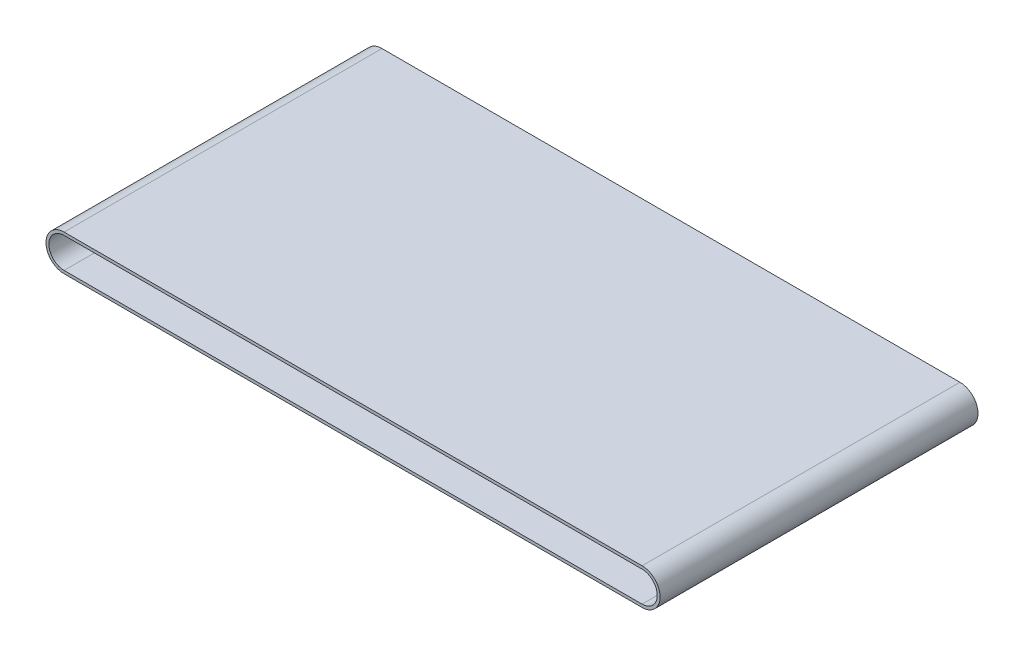
ISO-10303-21;
HEADER;
FILE_DESCRIPTION(('STEP AP214'),'2;1');
FILE_NAME('part.step','',(''),(''),'','','');
FILE_SCHEMA(('AUTOMOTIVE_DESIGN { 1 0 10303 214 1 1 1 1 }'));
ENDSEC;
DATA;
#1=APPLICATION_CONTEXT('core data for automotive mechanical design processes');
#2=APPLICATION_PROTOCOL_DEFINITION('international standard','automotive_design',2000,#1);
#3=PRODUCT_CONTEXT('',#1,'mechanical');
#4=PRODUCT('Part','Part','',(#3));
#5=PRODUCT_RELATED_PRODUCT_CATEGORY('part','',(#4));
#6=PRODUCT_DEFINITION_FORMATION('','',#4);
#7=PRODUCT_DEFINITION_CONTEXT('part definition',#1,'design');
#8=PRODUCT_DEFINITION('design','',#6,#7);
#9=PRODUCT_DEFINITION_SHAPE('','',#8);
#10=(LENGTH_UNIT() NAMED_UNIT(*) SI_UNIT(.MILLI.,.METRE.));
#11=(NAMED_UNIT(*) PLANE_ANGLE_UNIT() SI_UNIT($,.RADIAN.));
#12=(NAMED_UNIT(*) SI_UNIT($,.STERADIAN.) SOLID_ANGLE_UNIT());
#13=UNCERTAINTY_MEASURE_WITH_UNIT(LENGTH_MEASURE(1.E-05),#10,'distance_accuracy_value','');
#14=(GEOMETRIC_REPRESENTATION_CONTEXT(3) GLOBAL_UNCERTAINTY_ASSIGNED_CONTEXT((#13)) GLOBAL_UNIT_ASSIGNED_CONTEXT((#10,
#11,#12)) REPRESENTATION_CONTEXT('',''));
#15=CARTESIAN_POINT('',(0.,0.,0.));
#16=DIRECTION('',(0.,0.,1.));
#17=DIRECTION('',(1.,0.,0.));
#18=AXIS2_PLACEMENT_3D('',#15,#16,#17);
#19=CARTESIAN_POINT('',(-254.,0.,139.7));
#20=DIRECTION('',(0.,0.,-1.));
#21=DIRECTION('',(-1.,0.,0.));
#22=AXIS2_PLACEMENT_3D('',#19,#20,#21);
#23=CYLINDRICAL_SURFACE('',#22,15.875);
#24=CARTESIAN_POINT('',(-254.,0.,-139.7));
#25=DIRECTION('',(0.,0.,1.));
#26=DIRECTION('',(-1.,0.,0.));
#27=AXIS2_PLACEMENT_3D('',#24,#25,#26);
#28=CIRCLE('',#27,15.875);
#29=CARTESIAN_POINT('',(-254.,15.875,-139.7));
#30=VERTEX_POINT('',#29);
#31=CARTESIAN_POINT('',(-254.,-15.875,-139.7));
#32=VERTEX_POINT('',#31);
#33=EDGE_CURVE('E111',#30,#32,#28,.T.);
#34=ORIENTED_EDGE('',*,*,#33,.T.);
#35=DIRECTION('',(0.,0.,-1.));
#36=VECTOR('',#35,1.);
#37=CARTESIAN_POINT('',(-254.,-15.875,139.7));
#38=LINE('',#37,#36);
#39=CARTESIAN_POINT('',(-254.,-15.875,139.7));
#40=VERTEX_POINT('',#39);
#41=EDGE_CURVE('E11',#40,#32,#38,.T.);
#42=ORIENTED_EDGE('',*,*,#41,.F.);
#43=CARTESIAN_POINT('',(-254.,0.,139.7));
#44=DIRECTION('',(0.,0.,1.));
#45=DIRECTION('',(-1.,0.,0.));
#46=AXIS2_PLACEMENT_3D('',#43,#44,#45);
#47=CIRCLE('',#46,15.875);
#48=CARTESIAN_POINT('',(-254.,15.875,139.7));
#49=VERTEX_POINT('',#48);
#50=EDGE_CURVE('E150',#49,#40,#47,.T.);
#51=ORIENTED_EDGE('',*,*,#50,.F.);
#52=DIRECTION('',(0.,0.,-1.));
#53=VECTOR('',#52,1.);
#54=CARTESIAN_POINT('',(-254.,15.875,139.7));
#55=LINE('',#54,#53);
#56=EDGE_CURVE('E164',#49,#30,#55,.T.);
#57=ORIENTED_EDGE('',*,*,#56,.T.);
#58=EDGE_LOOP('',(#34,#42,#51,#57));
#59=FACE_BOUND('',#58,.T.);
#60=ADVANCED_FACE('F39',(#59),#23,.T.);
#61=CARTESIAN_POINT('',(-254.,-15.875,139.7));
#62=DIRECTION('',(0.,1.,0.));
#63=DIRECTION('',(0.,0.,1.));
#64=AXIS2_PLACEMENT_3D('',#61,#62,#63);
#65=PLANE('',#64);
#66=DIRECTION('',(1.,0.,0.));
#67=VECTOR('',#66,1.);
#68=CARTESIAN_POINT('',(-254.,-15.875,-139.7));
#69=LINE('',#68,#67);
#70=CARTESIAN_POINT('',(254.,-15.875,-139.7));
#71=VERTEX_POINT('',#70);
#72=EDGE_CURVE('E168',#32,#71,#69,.T.);
#73=ORIENTED_EDGE('',*,*,#72,.T.);
#74=DIRECTION('',(0.,0.,-1.));
#75=VECTOR('',#74,1.);
#76=CARTESIAN_POINT('',(254.,-15.875,139.7));
#77=LINE('',#76,#75);
#78=CARTESIAN_POINT('',(254.,-15.875,139.7));
#79=VERTEX_POINT('',#78);
#80=EDGE_CURVE('E47',#79,#71,#77,.T.);
#81=ORIENTED_EDGE('',*,*,#80,.F.);
#82=DIRECTION('',(1.,0.,0.));
#83=VECTOR('',#82,1.);
#84=CARTESIAN_POINT('',(-254.,-15.875,139.7));
#85=LINE('',#84,#83);
#86=EDGE_CURVE('E154',#40,#79,#85,.T.);
#87=ORIENTED_EDGE('',*,*,#86,.F.);
#88=ORIENTED_EDGE('',*,*,#41,.T.);
#89=EDGE_LOOP('',(#73,#81,#87,#88));
#90=FACE_BOUND('',#89,.T.);
#91=ADVANCED_FACE('F202',(#90),#65,.F.);
#92=CARTESIAN_POINT('',(254.,0.,139.7));
#93=DIRECTION('',(0.,0.,-1.));
#94=DIRECTION('',(-1.,0.,0.));
#95=AXIS2_PLACEMENT_3D('',#92,#93,#94);
#96=CYLINDRICAL_SURFACE('',#95,15.875);
#97=CARTESIAN_POINT('',(254.,0.,-139.7));
#98=DIRECTION('',(0.,0.,1.));
#99=DIRECTION('',(-1.,0.,0.));
#100=AXIS2_PLACEMENT_3D('',#97,#98,#99);
#101=CIRCLE('',#100,15.875);
#102=CARTESIAN_POINT('',(254.,15.875,-139.7));
#103=VERTEX_POINT('',#102);
#104=EDGE_CURVE('E171',#71,#103,#101,.T.);
#105=ORIENTED_EDGE('',*,*,#104,.T.);
#106=DIRECTION('',(0.,0.,-1.));
#107=VECTOR('',#106,1.);
#108=CARTESIAN_POINT('',(254.,15.875,139.7));
#109=LINE('',#108,#107);
#110=CARTESIAN_POINT('',(254.,15.875,139.7));
#111=VERTEX_POINT('',#110);
#112=EDGE_CURVE('E179',#111,#103,#109,.T.);
#113=ORIENTED_EDGE('',*,*,#112,.F.);
#114=CARTESIAN_POINT('',(254.,0.,139.7));
#115=DIRECTION('',(0.,0.,1.));
#116=DIRECTION('',(-1.,0.,0.));
#117=AXIS2_PLACEMENT_3D('',#114,#115,#116);
#118=CIRCLE('',#117,15.875);
#119=EDGE_CURVE('E158',#79,#111,#118,.T.);
#120=ORIENTED_EDGE('',*,*,#119,.F.);
#121=ORIENTED_EDGE('',*,*,#80,.T.);
#122=EDGE_LOOP('',(#105,#113,#120,#121));
#123=FACE_BOUND('',#122,.T.);
#124=ADVANCED_FACE('F188',(#123),#96,.T.);
#125=CARTESIAN_POINT('',(-254.,15.875,139.7));
#126=DIRECTION('',(0.,-1.,0.));
#127=DIRECTION('',(0.,0.,-1.));
#128=AXIS2_PLACEMENT_3D('',#125,#126,#127);
#129=PLANE('',#128);
#130=DIRECTION('',(-1.,0.,0.));
#131=VECTOR('',#130,1.);
#132=CARTESIAN_POINT('',(-254.,15.875,-139.7));
#133=LINE('',#132,#131);
#134=EDGE_CURVE('E155',#103,#30,#133,.T.);
#135=ORIENTED_EDGE('',*,*,#134,.T.);
#136=ORIENTED_EDGE('',*,*,#56,.F.);
#137=DIRECTION('',(-1.,0.,0.));
#138=VECTOR('',#137,1.);
#139=CARTESIAN_POINT('',(-254.,15.875,139.7));
#140=LINE('',#139,#138);
#141=EDGE_CURVE('E161',#111,#49,#140,.T.);
#142=ORIENTED_EDGE('',*,*,#141,.F.);
#143=ORIENTED_EDGE('',*,*,#112,.T.);
#144=EDGE_LOOP('',(#135,#136,#142,#143));
#145=FACE_BOUND('',#144,.T.);
#146=ADVANCED_FACE('F195',(#145),#129,.F.);
#147=CARTESIAN_POINT('',(-254.,0.,139.7));
#148=DIRECTION('',(0.,0.,-1.));
#149=DIRECTION('',(-1.,0.,0.));
#150=AXIS2_PLACEMENT_3D('',#147,#148,#149);
#151=PLANE('',#150);
#152=DIRECTION('',(1.,0.,0.));
#153=VECTOR('',#152,1.);
#154=CARTESIAN_POINT('',(-254.,-13.335,139.7));
#155=LINE('',#154,#153);
#156=CARTESIAN_POINT('',(-254.,-13.335,139.7));
#157=VERTEX_POINT('',#156);
#158=CARTESIAN_POINT('',(254.,-13.335,139.7));
#159=VERTEX_POINT('',#158);
#160=EDGE_CURVE('E128',#157,#159,#155,.T.);
#161=ORIENTED_EDGE('',*,*,#160,.F.);
#162=CARTESIAN_POINT('',(-254.,0.,139.7));
#163=DIRECTION('',(0.,0.,1.));
#164=DIRECTION('',(1.,0.,0.));
#165=AXIS2_PLACEMENT_3D('',#162,#163,#164);
#166=CIRCLE('',#165,13.335);
#167=CARTESIAN_POINT('',(-254.,13.335,139.7));
#168=VERTEX_POINT('',#167);
#169=EDGE_CURVE('E54',#168,#157,#166,.T.);
#170=ORIENTED_EDGE('',*,*,#169,.F.);
#171=DIRECTION('',(-1.,0.,0.));
#172=VECTOR('',#171,1.);
#173=CARTESIAN_POINT('',(-254.,13.335,139.7));
#174=LINE('',#173,#172);
#175=CARTESIAN_POINT('',(254.,13.335,139.7));
#176=VERTEX_POINT('',#175);
#177=EDGE_CURVE('E118',#176,#168,#174,.T.);
#178=ORIENTED_EDGE('',*,*,#177,.F.);
#179=CARTESIAN_POINT('',(254.,0.,139.7));
#180=DIRECTION('',(0.,0.,1.));
#181=DIRECTION('',(-1.,0.,0.));
#182=AXIS2_PLACEMENT_3D('',#179,#180,#181);
#183=CIRCLE('',#182,13.335);
#184=EDGE_CURVE('E136',#159,#176,#183,.T.);
#185=ORIENTED_EDGE('',*,*,#184,.F.);
#186=EDGE_LOOP('',(#161,#170,#178,#185));
#187=FACE_BOUND('',#186,.T.);
#188=ORIENTED_EDGE('',*,*,#50,.T.);
#189=ORIENTED_EDGE('',*,*,#86,.T.);
#190=ORIENTED_EDGE('',*,*,#119,.T.);
#191=ORIENTED_EDGE('',*,*,#141,.T.);
#192=EDGE_LOOP('',(#188,#189,#190,#191));
#193=FACE_BOUND('',#192,.T.);
#194=ADVANCED_FACE('F201',(#187,#193),#151,.F.);
#195=CARTESIAN_POINT('',(-254.,0.,-139.7));
#196=DIRECTION('',(0.,0.,-1.));
#197=DIRECTION('',(-1.,0.,0.));
#198=AXIS2_PLACEMENT_3D('',#195,#196,#197);
#199=PLANE('',#198);
#200=CARTESIAN_POINT('',(-254.,0.,-139.7));
#201=DIRECTION('',(0.,0.,-1.));
#202=DIRECTION('',(-1.,0.,0.));
#203=AXIS2_PLACEMENT_3D('',#200,#201,#202);
#204=CIRCLE('',#203,13.335);
#205=CARTESIAN_POINT('',(-254.,13.335,-139.7));
#206=VERTEX_POINT('',#205);
#207=CARTESIAN_POINT('',(-254.,-13.335,-139.7));
#208=VERTEX_POINT('',#207);
#209=EDGE_CURVE('E115',#206,#208,#204,.F.);
#210=ORIENTED_EDGE('',*,*,#209,.T.);
#211=DIRECTION('',(1.,0.,0.));
#212=VECTOR('',#211,1.);
#213=CARTESIAN_POINT('',(-254.,-13.335,-139.7));
#214=LINE('',#213,#212);
#215=CARTESIAN_POINT('',(254.,-13.335,-139.7));
#216=VERTEX_POINT('',#215);
#217=EDGE_CURVE('E103',#208,#216,#214,.T.);
#218=ORIENTED_EDGE('',*,*,#217,.T.);
#219=CARTESIAN_POINT('',(254.,0.,-139.7));
#220=DIRECTION('',(0.,0.,-1.));
#221=DIRECTION('',(-1.,0.,0.));
#222=AXIS2_PLACEMENT_3D('',#219,#220,#221);
#223=CIRCLE('',#222,13.335);
#224=CARTESIAN_POINT('',(254.,13.335,-139.7));
#225=VERTEX_POINT('',#224);
#226=EDGE_CURVE('E130',#216,#225,#223,.F.);
#227=ORIENTED_EDGE('',*,*,#226,.T.);
#228=DIRECTION('',(-1.,0.,0.));
#229=VECTOR('',#228,1.);
#230=CARTESIAN_POINT('',(-254.,13.335,-139.7));
#231=LINE('',#230,#229);
#232=EDGE_CURVE('E123',#225,#206,#231,.T.);
#233=ORIENTED_EDGE('',*,*,#232,.T.);
#234=EDGE_LOOP('',(#210,#218,#227,#233));
#235=FACE_BOUND('',#234,.T.);
#236=ORIENTED_EDGE('',*,*,#33,.F.);
#237=ORIENTED_EDGE('',*,*,#134,.F.);
#238=ORIENTED_EDGE('',*,*,#104,.F.);
#239=ORIENTED_EDGE('',*,*,#72,.F.);
#240=EDGE_LOOP('',(#236,#237,#238,#239));
#241=FACE_BOUND('',#240,.T.);
#242=ADVANCED_FACE('F121',(#235,#241),#199,.T.);
#243=CARTESIAN_POINT('',(-254.,0.,-139.701));
#244=DIRECTION('',(0.,0.,1.));
#245=DIRECTION('',(1.,0.,0.));
#246=AXIS2_PLACEMENT_3D('',#243,#244,#245);
#247=CYLINDRICAL_SURFACE('',#246,13.335);
#248=DIRECTION('',(0.,0.,1.));
#249=VECTOR('',#248,1.);
#250=CARTESIAN_POINT('',(-254.,13.335,-139.701));
#251=LINE('',#250,#249);
#252=EDGE_CURVE('E112',#206,#168,#251,.T.);
#253=ORIENTED_EDGE('',*,*,#252,.T.);
#254=ORIENTED_EDGE('',*,*,#169,.T.);
#255=DIRECTION('',(0.,0.,1.));
#256=VECTOR('',#255,1.);
#257=CARTESIAN_POINT('',(-254.,-13.335,-139.701));
#258=LINE('',#257,#256);
#259=EDGE_CURVE('E105',#208,#157,#258,.T.);
#260=ORIENTED_EDGE('',*,*,#259,.F.);
#261=ORIENTED_EDGE('',*,*,#209,.F.);
#262=EDGE_LOOP('',(#253,#254,#260,#261));
#263=FACE_BOUND('',#262,.T.);
#264=ADVANCED_FACE('F114',(#263),#247,.F.);
#265=CARTESIAN_POINT('',(-254.,13.335,-139.701));
#266=DIRECTION('',(0.,1.,0.));
#267=DIRECTION('',(0.,0.,1.));
#268=AXIS2_PLACEMENT_3D('',#265,#266,#267);
#269=PLANE('',#268);
#270=DIRECTION('',(0.,0.,1.));
#271=VECTOR('',#270,1.);
#272=CARTESIAN_POINT('',(254.,13.335,-139.701));
#273=LINE('',#272,#271);
#274=EDGE_CURVE('E145',#225,#176,#273,.T.);
#275=ORIENTED_EDGE('',*,*,#274,.T.);
#276=ORIENTED_EDGE('',*,*,#177,.T.);
#277=ORIENTED_EDGE('',*,*,#252,.F.);
#278=ORIENTED_EDGE('',*,*,#232,.F.);
#279=EDGE_LOOP('',(#275,#276,#277,#278));
#280=FACE_BOUND('',#279,.T.);
#281=ADVANCED_FACE('F219',(#280),#269,.F.);
#282=CARTESIAN_POINT('',(254.,0.,-139.701));
#283=DIRECTION('',(0.,0.,1.));
#284=DIRECTION('',(1.,0.,0.));
#285=AXIS2_PLACEMENT_3D('',#282,#283,#284);
#286=CYLINDRICAL_SURFACE('',#285,13.335);
#287=DIRECTION('',(0.,0.,1.));
#288=VECTOR('',#287,1.);
#289=CARTESIAN_POINT('',(254.,-13.335,-139.701));
#290=LINE('',#289,#288);
#291=EDGE_CURVE('E62',#216,#159,#290,.T.);
#292=ORIENTED_EDGE('',*,*,#291,.T.);
#293=ORIENTED_EDGE('',*,*,#184,.T.);
#294=ORIENTED_EDGE('',*,*,#274,.F.);
#295=ORIENTED_EDGE('',*,*,#226,.F.);
#296=EDGE_LOOP('',(#292,#293,#294,#295));
#297=FACE_BOUND('',#296,.T.);
#298=ADVANCED_FACE('F222',(#297),#286,.F.);
#299=CARTESIAN_POINT('',(-254.,-13.335,-139.701));
#300=DIRECTION('',(0.,-1.,0.));
#301=DIRECTION('',(0.,0.,-1.));
#302=AXIS2_PLACEMENT_3D('',#299,#300,#301);
#303=PLANE('',#302);
#304=ORIENTED_EDGE('',*,*,#259,.T.);
#305=ORIENTED_EDGE('',*,*,#160,.T.);
#306=ORIENTED_EDGE('',*,*,#291,.F.);
#307=ORIENTED_EDGE('',*,*,#217,.F.);
#308=EDGE_LOOP('',(#304,#305,#306,#307));
#309=FACE_BOUND('',#308,.T.);
#310=ADVANCED_FACE('F104',(#309),#303,.F.);
#311=CLOSED_SHELL('',(#60,#91,#124,#146,#194,#242,#264,#281,#298,#310));
#312=MANIFOLD_SOLID_BREP('B2',#311);
#313=ADVANCED_BREP_SHAPE_REPRESENTATION('',(#18,#312),#14);
#314=SHAPE_DEFINITION_REPRESENTATION(#9,#313);
ENDSEC;
END-ISO-10303-21;
